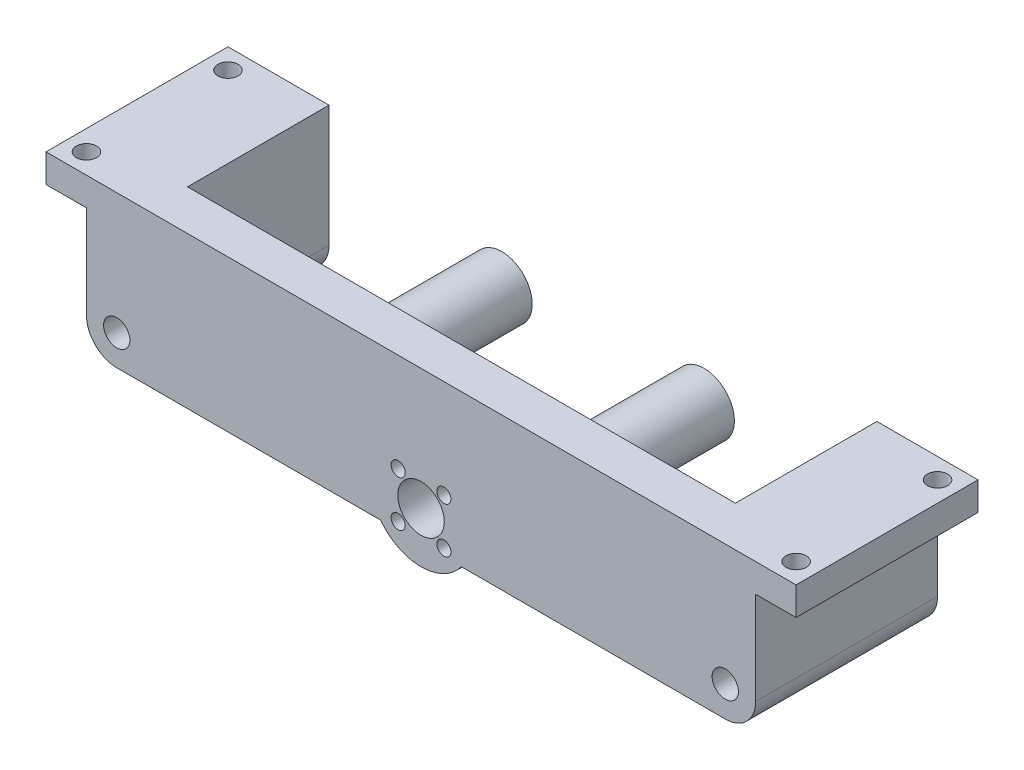
ISO-10303-21;
HEADER;
FILE_DESCRIPTION(('STEP AP214'),'2;1');
FILE_NAME('part.step','',(''),(''),'','','');
FILE_SCHEMA(('AUTOMOTIVE_DESIGN { 1 0 10303 214 1 1 1 1 }'));
ENDSEC;
DATA;
#1=APPLICATION_CONTEXT('core data for automotive mechanical design processes');
#2=APPLICATION_PROTOCOL_DEFINITION('international standard','automotive_design',2000,#1);
#3=PRODUCT_CONTEXT('',#1,'mechanical');
#4=PRODUCT('Part','Part','',(#3));
#5=PRODUCT_RELATED_PRODUCT_CATEGORY('part','',(#4));
#6=PRODUCT_DEFINITION_FORMATION('','',#4);
#7=PRODUCT_DEFINITION_CONTEXT('part definition',#1,'design');
#8=PRODUCT_DEFINITION('design','',#6,#7);
#9=PRODUCT_DEFINITION_SHAPE('','',#8);
#10=(LENGTH_UNIT() NAMED_UNIT(*) SI_UNIT(.MILLI.,.METRE.));
#11=(NAMED_UNIT(*) PLANE_ANGLE_UNIT() SI_UNIT($,.RADIAN.));
#12=(NAMED_UNIT(*) SI_UNIT($,.STERADIAN.) SOLID_ANGLE_UNIT());
#13=UNCERTAINTY_MEASURE_WITH_UNIT(LENGTH_MEASURE(1.E-05),#10,'distance_accuracy_value','');
#14=(GEOMETRIC_REPRESENTATION_CONTEXT(3) GLOBAL_UNCERTAINTY_ASSIGNED_CONTEXT((#13)) GLOBAL_UNIT_ASSIGNED_CONTEXT((#10,
#11,#12)) REPRESENTATION_CONTEXT('',''));
#15=CARTESIAN_POINT('',(0.,0.,0.));
#16=DIRECTION('',(0.,0.,1.));
#17=DIRECTION('',(1.,0.,0.));
#18=AXIS2_PLACEMENT_3D('',#15,#16,#17);
#19=CARTESIAN_POINT('',(0.,0.,0.));
#20=DIRECTION('',(0.,0.,1.));
#21=DIRECTION('',(1.,0.,0.));
#22=AXIS2_PLACEMENT_3D('',#19,#20,#21);
#23=PLANE('',#22);
#24=CARTESIAN_POINT('',(-25.,12.5,0.));
#25=DIRECTION('',(0.,0.,1.));
#26=DIRECTION('',(1.,0.,0.));
#27=AXIS2_PLACEMENT_3D('',#24,#25,#26);
#28=CIRCLE('',#27,7.5);
#29=CARTESIAN_POINT('',(-17.5,12.5,0.));
#30=VERTEX_POINT('',#29);
#31=EDGE_CURVE('E465',#30,#30,#28,.T.);
#32=ORIENTED_EDGE('',*,*,#31,.T.);
#33=EDGE_LOOP('',(#32));
#34=FACE_BOUND('',#33,.T.);
#35=CARTESIAN_POINT('',(25.,12.5,0.));
#36=DIRECTION('',(0.,0.,1.));
#37=DIRECTION('',(1.,0.,0.));
#38=AXIS2_PLACEMENT_3D('',#35,#36,#37);
#39=CIRCLE('',#38,7.5);
#40=CARTESIAN_POINT('',(32.5,12.5,0.));
#41=VERTEX_POINT('',#40);
#42=EDGE_CURVE('E12',#41,#41,#39,.F.);
#43=ORIENTED_EDGE('',*,*,#42,.F.);
#44=EDGE_LOOP('',(#43));
#45=FACE_BOUND('',#44,.T.);
#46=CARTESIAN_POINT('',(-75.25,0.,0.));
#47=DIRECTION('',(0.,0.,-1.));
#48=DIRECTION('',(-1.,0.,0.));
#49=AXIS2_PLACEMENT_3D('',#46,#47,#48);
#50=CIRCLE('',#49,7.50000000000001);
#51=CARTESIAN_POINT('',(-75.25,-7.50000000000002,0.));
#52=VERTEX_POINT('',#51);
#53=CARTESIAN_POINT('',(-67.75,0.,0.));
#54=VERTEX_POINT('',#53);
#55=EDGE_CURVE('E190',#52,#54,#50,.F.);
#56=ORIENTED_EDGE('',*,*,#55,.T.);
#57=DIRECTION('',(0.,1.,0.));
#58=VECTOR('',#57,1.);
#59=CARTESIAN_POINT('',(-67.75,0.,0.));
#60=LINE('',#59,#58);
#61=CARTESIAN_POINT('',(-67.75,30.,0.));
#62=VERTEX_POINT('',#61);
#63=EDGE_CURVE('E195',#54,#62,#60,.T.);
#64=ORIENTED_EDGE('',*,*,#63,.T.);
#65=DIRECTION('',(-1.,0.,0.));
#66=VECTOR('',#65,1.);
#67=CARTESIAN_POINT('',(0.,30.,0.));
#68=LINE('',#67,#66);
#69=CARTESIAN_POINT('',(67.75,30.,0.));
#70=VERTEX_POINT('',#69);
#71=EDGE_CURVE('E307',#70,#62,#68,.T.);
#72=ORIENTED_EDGE('',*,*,#71,.F.);
#73=DIRECTION('',(0.,1.,0.));
#74=VECTOR('',#73,1.);
#75=CARTESIAN_POINT('',(67.75,0.,0.));
#76=LINE('',#75,#74);
#77=CARTESIAN_POINT('',(67.75,0.,0.));
#78=VERTEX_POINT('',#77);
#79=EDGE_CURVE('E323',#78,#70,#76,.T.);
#80=ORIENTED_EDGE('',*,*,#79,.F.);
#81=CARTESIAN_POINT('',(75.25,0.,0.));
#82=DIRECTION('',(0.,0.,-1.));
#83=DIRECTION('',(-1.,0.,0.));
#84=AXIS2_PLACEMENT_3D('',#81,#82,#83);
#85=CIRCLE('',#84,7.50000000000001);
#86=CARTESIAN_POINT('',(75.25,-7.5,0.));
#87=VERTEX_POINT('',#86);
#88=EDGE_CURVE('E182',#87,#78,#85,.T.);
#89=ORIENTED_EDGE('',*,*,#88,.F.);
#90=DIRECTION('',(-1.,0.,0.));
#91=VECTOR('',#90,1.);
#92=CARTESIAN_POINT('',(0.,-7.50000000000001,0.));
#93=LINE('',#92,#91);
#94=CARTESIAN_POINT('',(10.,-7.5,0.));
#95=VERTEX_POINT('',#94);
#96=EDGE_CURVE('E399',#87,#95,#93,.T.);
#97=ORIENTED_EDGE('',*,*,#96,.T.);
#98=CARTESIAN_POINT('',(0.,0.,0.));
#99=DIRECTION('',(0.,0.,1.));
#100=DIRECTION('',(1.,0.,0.));
#101=AXIS2_PLACEMENT_3D('',#98,#99,#100);
#102=CIRCLE('',#101,12.5);
#103=CARTESIAN_POINT('',(-10.,-7.50000000000001,0.));
#104=VERTEX_POINT('',#103);
#105=EDGE_CURVE('E395',#104,#95,#102,.T.);
#106=ORIENTED_EDGE('',*,*,#105,.F.);
#107=DIRECTION('',(1.,0.,0.));
#108=VECTOR('',#107,1.);
#109=CARTESIAN_POINT('',(0.,-7.50000000000001,0.));
#110=LINE('',#109,#108);
#111=EDGE_CURVE('E393',#52,#104,#110,.T.);
#112=ORIENTED_EDGE('',*,*,#111,.F.);
#113=EDGE_LOOP('',(#56,#64,#72,#80,#89,#97,#106,#112));
#114=FACE_BOUND('',#113,.T.);
#115=CARTESIAN_POINT('',(0.,0.,0.));
#116=DIRECTION('',(0.,0.,1.));
#117=DIRECTION('',(1.,0.,0.));
#118=AXIS2_PLACEMENT_3D('',#115,#116,#117);
#119=CIRCLE('',#118,5.75);
#120=CARTESIAN_POINT('',(5.75,0.,0.));
#121=VERTEX_POINT('',#120);
#122=EDGE_CURVE('E354',#121,#121,#119,.T.);
#123=ORIENTED_EDGE('',*,*,#122,.T.);
#124=EDGE_LOOP('',(#123));
#125=FACE_BOUND('',#124,.T.);
#126=CARTESIAN_POINT('',(-5.65685424949238,5.65685424949238,0.));
#127=DIRECTION('',(0.,0.,1.));
#128=DIRECTION('',(1.,0.,0.));
#129=AXIS2_PLACEMENT_3D('',#126,#127,#128);
#130=CIRCLE('',#129,1.75);
#131=CARTESIAN_POINT('',(-3.90685424949238,5.65685424949238,0.));
#132=VERTEX_POINT('',#131);
#133=EDGE_CURVE('E412',#132,#132,#130,.T.);
#134=ORIENTED_EDGE('',*,*,#133,.T.);
#135=EDGE_LOOP('',(#134));
#136=FACE_BOUND('',#135,.T.);
#137=CARTESIAN_POINT('',(5.65685424949238,5.65685424949238,0.));
#138=DIRECTION('',(0.,0.,1.));
#139=DIRECTION('',(1.,0.,0.));
#140=AXIS2_PLACEMENT_3D('',#137,#138,#139);
#141=CIRCLE('',#140,1.75);
#142=CARTESIAN_POINT('',(7.40685424949238,5.65685424949238,0.));
#143=VERTEX_POINT('',#142);
#144=EDGE_CURVE('E409',#143,#143,#141,.T.);
#145=ORIENTED_EDGE('',*,*,#144,.T.);
#146=EDGE_LOOP('',(#145));
#147=FACE_BOUND('',#146,.T.);
#148=CARTESIAN_POINT('',(5.65685424949238,-5.65685424949238,0.));
#149=DIRECTION('',(0.,0.,1.));
#150=DIRECTION('',(1.,0.,0.));
#151=AXIS2_PLACEMENT_3D('',#148,#149,#150);
#152=CIRCLE('',#151,1.75);
#153=CARTESIAN_POINT('',(7.40685424949238,-5.65685424949238,0.));
#154=VERTEX_POINT('',#153);
#155=EDGE_CURVE('E406',#154,#154,#152,.T.);
#156=ORIENTED_EDGE('',*,*,#155,.T.);
#157=EDGE_LOOP('',(#156));
#158=FACE_BOUND('',#157,.T.);
#159=CARTESIAN_POINT('',(-5.65685424949238,-5.65685424949238,0.));
#160=DIRECTION('',(0.,0.,1.));
#161=DIRECTION('',(1.,0.,0.));
#162=AXIS2_PLACEMENT_3D('',#159,#160,#161);
#163=CIRCLE('',#162,1.75);
#164=CARTESIAN_POINT('',(-3.90685424949238,-5.65685424949238,0.));
#165=VERTEX_POINT('',#164);
#166=EDGE_CURVE('E403',#165,#165,#163,.T.);
#167=ORIENTED_EDGE('',*,*,#166,.T.);
#168=EDGE_LOOP('',(#167));
#169=FACE_BOUND('',#168,.T.);
#170=ADVANCED_FACE('F173',(#34,#45,#114,#125,#136,#147,#158,#169),#23,.F.);
#171=CARTESIAN_POINT('',(75.25,0.,10.));
#172=DIRECTION('',(0.,0.,-1.));
#173=DIRECTION('',(-1.,0.,0.));
#174=AXIS2_PLACEMENT_3D('',#171,#172,#173);
#175=CYLINDRICAL_SURFACE('',#174,3.25000000000001);
#176=CARTESIAN_POINT('',(75.25,0.,10.));
#177=DIRECTION('',(0.,0.,1.));
#178=DIRECTION('',(1.,0.,0.));
#179=AXIS2_PLACEMENT_3D('',#176,#177,#178);
#180=CIRCLE('',#179,3.25000000000001);
#181=CARTESIAN_POINT('',(78.5,0.,10.));
#182=VERTEX_POINT('',#181);
#183=EDGE_CURVE('E389',#182,#182,#180,.F.);
#184=ORIENTED_EDGE('',*,*,#183,.F.);
#185=EDGE_LOOP('',(#184));
#186=FACE_BOUND('',#185,.T.);
#187=CARTESIAN_POINT('',(75.25,0.,-35.));
#188=DIRECTION('',(0.,0.,-1.));
#189=DIRECTION('',(-1.,0.,0.));
#190=AXIS2_PLACEMENT_3D('',#187,#188,#189);
#191=CIRCLE('',#190,3.25000000000001);
#192=CARTESIAN_POINT('',(72.,0.,-35.));
#193=VERTEX_POINT('',#192);
#194=EDGE_CURVE('E336',#193,#193,#191,.F.);
#195=ORIENTED_EDGE('',*,*,#194,.F.);
#196=EDGE_LOOP('',(#195));
#197=FACE_BOUND('',#196,.T.);
#198=ADVANCED_FACE('F552',(#186,#197),#175,.F.);
#199=CARTESIAN_POINT('',(75.25,0.,10.));
#200=DIRECTION('',(0.,0.,-1.));
#201=DIRECTION('',(-1.,0.,0.));
#202=AXIS2_PLACEMENT_3D('',#199,#200,#201);
#203=CYLINDRICAL_SURFACE('',#202,7.50000000000001);
#204=DIRECTION('',(0.,0.,-1.));
#205=VECTOR('',#204,1.);
#206=CARTESIAN_POINT('',(75.25,-7.5,10.));
#207=LINE('',#206,#205);
#208=CARTESIAN_POINT('',(75.25,-7.5,10.));
#209=VERTEX_POINT('',#208);
#210=EDGE_CURVE('E420',#209,#87,#207,.T.);
#211=ORIENTED_EDGE('',*,*,#210,.T.);
#212=ORIENTED_EDGE('',*,*,#88,.T.);
#213=DIRECTION('',(0.,0.,1.));
#214=VECTOR('',#213,1.);
#215=CARTESIAN_POINT('',(67.75,0.,-35.));
#216=LINE('',#215,#214);
#217=CARTESIAN_POINT('',(67.75,0.,-35.));
#218=VERTEX_POINT('',#217);
#219=EDGE_CURVE('E346',#218,#78,#216,.T.);
#220=ORIENTED_EDGE('',*,*,#219,.F.);
#221=CARTESIAN_POINT('',(75.25,0.,-35.));
#222=DIRECTION('',(0.,0.,-1.));
#223=DIRECTION('',(-1.,0.,0.));
#224=AXIS2_PLACEMENT_3D('',#221,#222,#223);
#225=CIRCLE('',#224,7.50000000000001);
#226=CARTESIAN_POINT('',(82.75,0.,-35.));
#227=VERTEX_POINT('',#226);
#228=EDGE_CURVE('E322',#227,#218,#225,.T.);
#229=ORIENTED_EDGE('',*,*,#228,.F.);
#230=DIRECTION('',(0.,0.,-1.));
#231=VECTOR('',#230,1.);
#232=CARTESIAN_POINT('',(82.75,0.,10.));
#233=LINE('',#232,#231);
#234=CARTESIAN_POINT('',(82.75,0.,10.));
#235=VERTEX_POINT('',#234);
#236=EDGE_CURVE('E418',#235,#227,#233,.T.);
#237=ORIENTED_EDGE('',*,*,#236,.F.);
#238=CARTESIAN_POINT('',(75.25,0.,10.));
#239=DIRECTION('',(0.,0.,1.));
#240=DIRECTION('',(1.,0.,0.));
#241=AXIS2_PLACEMENT_3D('',#238,#239,#240);
#242=CIRCLE('',#241,7.50000000000001);
#243=EDGE_CURVE('E364',#235,#209,#242,.F.);
#244=ORIENTED_EDGE('',*,*,#243,.T.);
#245=EDGE_LOOP('',(#211,#212,#220,#229,#237,#244));
#246=FACE_BOUND('',#245,.T.);
#247=ADVANCED_FACE('F520',(#246),#203,.T.);
#248=CARTESIAN_POINT('',(0.,0.,10.));
#249=DIRECTION('',(0.,0.,1.));
#250=DIRECTION('',(1.,0.,0.));
#251=AXIS2_PLACEMENT_3D('',#248,#249,#250);
#252=PLANE('',#251);
#253=ORIENTED_EDGE('',*,*,#243,.F.);
#254=DIRECTION('',(0.,-1.,0.));
#255=VECTOR('',#254,1.);
#256=CARTESIAN_POINT('',(82.75,0.,10.));
#257=LINE('',#256,#255);
#258=CARTESIAN_POINT('',(82.75,23.,10.));
#259=VERTEX_POINT('',#258);
#260=EDGE_CURVE('E367',#259,#235,#257,.T.);
#261=ORIENTED_EDGE('',*,*,#260,.F.);
#262=DIRECTION('',(1.,0.,0.));
#263=VECTOR('',#262,1.);
#264=CARTESIAN_POINT('',(82.75,23.,10.));
#265=LINE('',#264,#263);
#266=CARTESIAN_POINT('',(92.75,23.,10.));
#267=VERTEX_POINT('',#266);
#268=EDGE_CURVE('E349',#259,#267,#265,.T.);
#269=ORIENTED_EDGE('',*,*,#268,.T.);
#270=DIRECTION('',(0.,-1.,0.));
#271=VECTOR('',#270,1.);
#272=CARTESIAN_POINT('',(92.75,30.,10.));
#273=LINE('',#272,#271);
#274=CARTESIAN_POINT('',(92.75,30.,10.));
#275=VERTEX_POINT('',#274);
#276=EDGE_CURVE('E443',#275,#267,#273,.T.);
#277=ORIENTED_EDGE('',*,*,#276,.F.);
#278=DIRECTION('',(-1.,0.,0.));
#279=VECTOR('',#278,1.);
#280=CARTESIAN_POINT('',(0.,30.,10.));
#281=LINE('',#280,#279);
#282=CARTESIAN_POINT('',(-92.75,30.,10.));
#283=VERTEX_POINT('',#282);
#284=EDGE_CURVE('E370',#275,#283,#281,.T.);
#285=ORIENTED_EDGE('',*,*,#284,.T.);
#286=DIRECTION('',(0.,-1.,0.));
#287=VECTOR('',#286,1.);
#288=CARTESIAN_POINT('',(-92.75,30.,10.));
#289=LINE('',#288,#287);
#290=CARTESIAN_POINT('',(-92.75,23.,10.));
#291=VERTEX_POINT('',#290);
#292=EDGE_CURVE('E435',#283,#291,#289,.T.);
#293=ORIENTED_EDGE('',*,*,#292,.T.);
#294=DIRECTION('',(-1.,0.,0.));
#295=VECTOR('',#294,1.);
#296=CARTESIAN_POINT('',(-82.75,23.,10.));
#297=LINE('',#296,#295);
#298=CARTESIAN_POINT('',(-82.75,23.,10.));
#299=VERTEX_POINT('',#298);
#300=EDGE_CURVE('E432',#299,#291,#297,.T.);
#301=ORIENTED_EDGE('',*,*,#300,.F.);
#302=DIRECTION('',(0.,-1.,0.));
#303=VECTOR('',#302,1.);
#304=CARTESIAN_POINT('',(-82.75,0.,10.));
#305=LINE('',#304,#303);
#306=CARTESIAN_POINT('',(-82.75,0.,10.));
#307=VERTEX_POINT('',#306);
#308=EDGE_CURVE('E372',#299,#307,#305,.T.);
#309=ORIENTED_EDGE('',*,*,#308,.T.);
#310=CARTESIAN_POINT('',(-75.25,0.,10.));
#311=DIRECTION('',(0.,0.,1.));
#312=DIRECTION('',(1.,0.,0.));
#313=AXIS2_PLACEMENT_3D('',#310,#311,#312);
#314=CIRCLE('',#313,7.50000000000001);
#315=CARTESIAN_POINT('',(-75.25,-7.50000000000002,10.));
#316=VERTEX_POINT('',#315);
#317=EDGE_CURVE('E353',#307,#316,#314,.T.);
#318=ORIENTED_EDGE('',*,*,#317,.T.);
#319=DIRECTION('',(1.,0.,0.));
#320=VECTOR('',#319,1.);
#321=CARTESIAN_POINT('',(0.,-7.50000000000001,10.));
#322=LINE('',#321,#320);
#323=CARTESIAN_POINT('',(-10.,-7.50000000000001,10.));
#324=VERTEX_POINT('',#323);
#325=EDGE_CURVE('E357',#316,#324,#322,.T.);
#326=ORIENTED_EDGE('',*,*,#325,.T.);
#327=CARTESIAN_POINT('',(0.,0.,10.));
#328=DIRECTION('',(0.,0.,1.));
#329=DIRECTION('',(1.,0.,0.));
#330=AXIS2_PLACEMENT_3D('',#327,#328,#329);
#331=CIRCLE('',#330,12.5);
#332=CARTESIAN_POINT('',(10.,-7.5,10.));
#333=VERTEX_POINT('',#332);
#334=EDGE_CURVE('E359',#324,#333,#331,.T.);
#335=ORIENTED_EDGE('',*,*,#334,.T.);
#336=DIRECTION('',(-1.,0.,0.));
#337=VECTOR('',#336,1.);
#338=CARTESIAN_POINT('',(0.,-7.50000000000001,10.));
#339=LINE('',#338,#337);
#340=EDGE_CURVE('E361',#209,#333,#339,.T.);
#341=ORIENTED_EDGE('',*,*,#340,.F.);
#342=EDGE_LOOP('',(#253,#261,#269,#277,#285,#293,#301,#309,#318,#326,#335,#341));
#343=FACE_BOUND('',#342,.T.);
#344=ORIENTED_EDGE('',*,*,#183,.T.);
#345=EDGE_LOOP('',(#344));
#346=FACE_BOUND('',#345,.T.);
#347=CARTESIAN_POINT('',(0.,0.,10.));
#348=DIRECTION('',(0.,0.,1.));
#349=DIRECTION('',(1.,0.,0.));
#350=AXIS2_PLACEMENT_3D('',#347,#348,#349);
#351=CIRCLE('',#350,5.75);
#352=CARTESIAN_POINT('',(5.75,0.,10.));
#353=VERTEX_POINT('',#352);
#354=EDGE_CURVE('E386',#353,#353,#351,.T.);
#355=ORIENTED_EDGE('',*,*,#354,.F.);
#356=EDGE_LOOP('',(#355));
#357=FACE_BOUND('',#356,.T.);
#358=CARTESIAN_POINT('',(-5.65685424949238,5.65685424949238,10.));
#359=DIRECTION('',(0.,0.,1.));
#360=DIRECTION('',(1.,0.,0.));
#361=AXIS2_PLACEMENT_3D('',#358,#359,#360);
#362=CIRCLE('',#361,1.75);
#363=CARTESIAN_POINT('',(-3.90685424949238,5.65685424949238,10.));
#364=VERTEX_POINT('',#363);
#365=EDGE_CURVE('E383',#364,#364,#362,.T.);
#366=ORIENTED_EDGE('',*,*,#365,.F.);
#367=EDGE_LOOP('',(#366));
#368=FACE_BOUND('',#367,.T.);
#369=CARTESIAN_POINT('',(5.65685424949238,5.65685424949238,10.));
#370=DIRECTION('',(0.,0.,1.));
#371=DIRECTION('',(1.,0.,0.));
#372=AXIS2_PLACEMENT_3D('',#369,#370,#371);
#373=CIRCLE('',#372,1.75);
#374=CARTESIAN_POINT('',(7.40685424949238,5.65685424949238,10.));
#375=VERTEX_POINT('',#374);
#376=EDGE_CURVE('E380',#375,#375,#373,.T.);
#377=ORIENTED_EDGE('',*,*,#376,.F.);
#378=EDGE_LOOP('',(#377));
#379=FACE_BOUND('',#378,.T.);
#380=CARTESIAN_POINT('',(5.65685424949238,-5.65685424949238,10.));
#381=DIRECTION('',(0.,0.,1.));
#382=DIRECTION('',(1.,0.,0.));
#383=AXIS2_PLACEMENT_3D('',#380,#381,#382);
#384=CIRCLE('',#383,1.75);
#385=CARTESIAN_POINT('',(7.40685424949238,-5.65685424949238,10.));
#386=VERTEX_POINT('',#385);
#387=EDGE_CURVE('E377',#386,#386,#384,.T.);
#388=ORIENTED_EDGE('',*,*,#387,.F.);
#389=EDGE_LOOP('',(#388));
#390=FACE_BOUND('',#389,.T.);
#391=CARTESIAN_POINT('',(-5.65685424949238,-5.65685424949238,10.));
#392=DIRECTION('',(0.,0.,1.));
#393=DIRECTION('',(1.,0.,0.));
#394=AXIS2_PLACEMENT_3D('',#391,#392,#393);
#395=CIRCLE('',#394,1.75);
#396=CARTESIAN_POINT('',(-3.90685424949238,-5.65685424949238,10.));
#397=VERTEX_POINT('',#396);
#398=EDGE_CURVE('E374',#397,#397,#395,.T.);
#399=ORIENTED_EDGE('',*,*,#398,.F.);
#400=EDGE_LOOP('',(#399));
#401=FACE_BOUND('',#400,.T.);
#402=CARTESIAN_POINT('',(-75.25,0.,10.));
#403=DIRECTION('',(0.,0.,1.));
#404=DIRECTION('',(1.,0.,0.));
#405=AXIS2_PLACEMENT_3D('',#402,#403,#404);
#406=CIRCLE('',#405,3.25000000000001);
#407=CARTESIAN_POINT('',(-72.,0.,10.));
#408=VERTEX_POINT('',#407);
#409=EDGE_CURVE('E350',#408,#408,#406,.T.);
#410=ORIENTED_EDGE('',*,*,#409,.F.);
#411=EDGE_LOOP('',(#410));
#412=FACE_BOUND('',#411,.T.);
#413=ADVANCED_FACE('F502',(#343,#346,#357,#368,#379,#390,#401,#412),#252,.T.);
#414=CARTESIAN_POINT('',(82.75,0.,10.));
#415=DIRECTION('',(1.,0.,0.));
#416=DIRECTION('',(0.,1.,0.));
#417=AXIS2_PLACEMENT_3D('',#414,#415,#416);
#418=PLANE('',#417);
#419=DIRECTION('',(0.,0.,-1.));
#420=VECTOR('',#419,1.);
#421=CARTESIAN_POINT('',(82.75,23.,10.));
#422=LINE('',#421,#420);
#423=CARTESIAN_POINT('',(82.75,23.,-35.));
#424=VERTEX_POINT('',#423);
#425=EDGE_CURVE('E342',#259,#424,#422,.T.);
#426=ORIENTED_EDGE('',*,*,#425,.F.);
#427=ORIENTED_EDGE('',*,*,#260,.T.);
#428=ORIENTED_EDGE('',*,*,#236,.T.);
#429=DIRECTION('',(0.,-1.,0.));
#430=VECTOR('',#429,1.);
#431=CARTESIAN_POINT('',(82.75,0.,-35.));
#432=LINE('',#431,#430);
#433=EDGE_CURVE('E319',#424,#227,#432,.T.);
#434=ORIENTED_EDGE('',*,*,#433,.F.);
#435=EDGE_LOOP('',(#426,#427,#428,#434));
#436=FACE_BOUND('',#435,.T.);
#437=ADVANCED_FACE('F548',(#436),#418,.T.);
#438=CARTESIAN_POINT('',(0.,30.,10.));
#439=DIRECTION('',(0.,-1.,0.));
#440=DIRECTION('',(1.,0.,0.));
#441=AXIS2_PLACEMENT_3D('',#438,#439,#440);
#442=PLANE('',#441);
#443=CARTESIAN_POINT('',(-87.75,30.,5.));
#444=DIRECTION('',(0.,1.,0.));
#445=DIRECTION('',(-1.,0.,0.));
#446=AXIS2_PLACEMENT_3D('',#443,#444,#445);
#447=CIRCLE('',#446,2.49999999999999);
#448=CARTESIAN_POINT('',(-90.25,30.,5.));
#449=VERTEX_POINT('',#448);
#450=EDGE_CURVE('E962',#449,#449,#447,.T.);
#451=ORIENTED_EDGE('',*,*,#450,.F.);
#452=EDGE_LOOP('',(#451));
#453=FACE_BOUND('',#452,.T.);
#454=CARTESIAN_POINT('',(87.75,30.,-30.));
#455=DIRECTION('',(0.,1.,0.));
#456=DIRECTION('',(-1.,0.,0.));
#457=AXIS2_PLACEMENT_3D('',#454,#455,#456);
#458=CIRCLE('',#457,2.50000000000001);
#459=CARTESIAN_POINT('',(85.25,30.,-30.));
#460=VERTEX_POINT('',#459);
#461=EDGE_CURVE('E960',#460,#460,#458,.T.);
#462=ORIENTED_EDGE('',*,*,#461,.F.);
#463=EDGE_LOOP('',(#462));
#464=FACE_BOUND('',#463,.T.);
#465=CARTESIAN_POINT('',(87.75,30.,4.99999999999997));
#466=DIRECTION('',(0.,1.,0.));
#467=DIRECTION('',(-1.,0.,0.));
#468=AXIS2_PLACEMENT_3D('',#465,#466,#467);
#469=CIRCLE('',#468,2.49999999999999);
#470=CARTESIAN_POINT('',(85.25,30.,4.99999999999997));
#471=VERTEX_POINT('',#470);
#472=EDGE_CURVE('E963',#471,#471,#469,.T.);
#473=ORIENTED_EDGE('',*,*,#472,.F.);
#474=EDGE_LOOP('',(#473));
#475=FACE_BOUND('',#474,.T.);
#476=CARTESIAN_POINT('',(-87.75,30.,-30.));
#477=DIRECTION('',(0.,1.,0.));
#478=DIRECTION('',(-1.,0.,0.));
#479=AXIS2_PLACEMENT_3D('',#476,#477,#478);
#480=CIRCLE('',#479,2.50000000000001);
#481=CARTESIAN_POINT('',(-90.25,30.,-30.));
#482=VERTEX_POINT('',#481);
#483=EDGE_CURVE('E454',#482,#482,#480,.T.);
#484=ORIENTED_EDGE('',*,*,#483,.F.);
#485=EDGE_LOOP('',(#484));
#486=FACE_BOUND('',#485,.T.);
#487=DIRECTION('',(0.,0.,-1.));
#488=VECTOR('',#487,1.);
#489=CARTESIAN_POINT('',(92.75,30.,10.));
#490=LINE('',#489,#488);
#491=CARTESIAN_POINT('',(92.75,30.,-35.));
#492=VERTEX_POINT('',#491);
#493=EDGE_CURVE('E446',#275,#492,#490,.T.);
#494=ORIENTED_EDGE('',*,*,#493,.T.);
#495=DIRECTION('',(1.,0.,0.));
#496=VECTOR('',#495,1.);
#497=CARTESIAN_POINT('',(0.,30.,-35.));
#498=LINE('',#497,#496);
#499=CARTESIAN_POINT('',(67.75,30.,-35.));
#500=VERTEX_POINT('',#499);
#501=EDGE_CURVE('E327',#500,#492,#498,.T.);
#502=ORIENTED_EDGE('',*,*,#501,.F.);
#503=DIRECTION('',(0.,0.,1.));
#504=VECTOR('',#503,1.);
#505=CARTESIAN_POINT('',(67.75,30.,-35.));
#506=LINE('',#505,#504);
#507=EDGE_CURVE('E339',#500,#70,#506,.T.);
#508=ORIENTED_EDGE('',*,*,#507,.T.);
#509=ORIENTED_EDGE('',*,*,#71,.T.);
#510=DIRECTION('',(0.,0.,1.));
#511=VECTOR('',#510,1.);
#512=CARTESIAN_POINT('',(-67.75,30.,-35.));
#513=LINE('',#512,#511);
#514=CARTESIAN_POINT('',(-67.75,30.,-35.));
#515=VERTEX_POINT('',#514);
#516=EDGE_CURVE('E304',#515,#62,#513,.T.);
#517=ORIENTED_EDGE('',*,*,#516,.F.);
#518=DIRECTION('',(1.,0.,0.));
#519=VECTOR('',#518,1.);
#520=CARTESIAN_POINT('',(0.,30.,-35.));
#521=LINE('',#520,#519);
#522=CARTESIAN_POINT('',(-92.75,30.,-35.));
#523=VERTEX_POINT('',#522);
#524=EDGE_CURVE('E288',#523,#515,#521,.T.);
#525=ORIENTED_EDGE('',*,*,#524,.F.);
#526=DIRECTION('',(0.,0.,-1.));
#527=VECTOR('',#526,1.);
#528=CARTESIAN_POINT('',(-92.75,30.,10.));
#529=LINE('',#528,#527);
#530=EDGE_CURVE('E396',#283,#523,#529,.T.);
#531=ORIENTED_EDGE('',*,*,#530,.F.);
#532=ORIENTED_EDGE('',*,*,#284,.F.);
#533=EDGE_LOOP('',(#494,#502,#508,#509,#517,#525,#531,#532));
#534=FACE_BOUND('',#533,.T.);
#535=ADVANCED_FACE('F305',(#453,#464,#475,#486,#534),#442,.F.);
#536=CARTESIAN_POINT('',(-82.75,0.,10.));
#537=DIRECTION('',(1.,0.,0.));
#538=DIRECTION('',(0.,1.,0.));
#539=AXIS2_PLACEMENT_3D('',#536,#537,#538);
#540=PLANE('',#539);
#541=ORIENTED_EDGE('',*,*,#308,.F.);
#542=DIRECTION('',(0.,0.,-1.));
#543=VECTOR('',#542,1.);
#544=CARTESIAN_POINT('',(-82.75,23.,10.));
#545=LINE('',#544,#543);
#546=CARTESIAN_POINT('',(-82.75,23.,-35.));
#547=VERTEX_POINT('',#546);
#548=EDGE_CURVE('E431',#299,#547,#545,.T.);
#549=ORIENTED_EDGE('',*,*,#548,.T.);
#550=DIRECTION('',(0.,1.,0.));
#551=VECTOR('',#550,1.);
#552=CARTESIAN_POINT('',(-82.75,0.,-35.));
#553=LINE('',#552,#551);
#554=CARTESIAN_POINT('',(-82.75,0.,-35.));
#555=VERTEX_POINT('',#554);
#556=EDGE_CURVE('E315',#555,#547,#553,.T.);
#557=ORIENTED_EDGE('',*,*,#556,.F.);
#558=DIRECTION('',(0.,0.,-1.));
#559=VECTOR('',#558,1.);
#560=CARTESIAN_POINT('',(-82.75,0.,10.));
#561=LINE('',#560,#559);
#562=EDGE_CURVE('E392',#307,#555,#561,.T.);
#563=ORIENTED_EDGE('',*,*,#562,.F.);
#564=EDGE_LOOP('',(#541,#549,#557,#563));
#565=FACE_BOUND('',#564,.T.);
#566=ADVANCED_FACE('F539',(#565),#540,.F.);
#567=CARTESIAN_POINT('',(-75.25,0.,10.));
#568=DIRECTION('',(0.,0.,-1.));
#569=DIRECTION('',(-1.,0.,0.));
#570=AXIS2_PLACEMENT_3D('',#567,#568,#569);
#571=CYLINDRICAL_SURFACE('',#570,7.50000000000001);
#572=ORIENTED_EDGE('',*,*,#562,.T.);
#573=CARTESIAN_POINT('',(-75.25,0.,-35.));
#574=DIRECTION('',(0.,0.,-1.));
#575=DIRECTION('',(-1.,0.,0.));
#576=AXIS2_PLACEMENT_3D('',#573,#574,#575);
#577=CIRCLE('',#576,7.50000000000001);
#578=CARTESIAN_POINT('',(-67.75,0.,-35.));
#579=VERTEX_POINT('',#578);
#580=EDGE_CURVE('E312',#555,#579,#577,.F.);
#581=ORIENTED_EDGE('',*,*,#580,.T.);
#582=DIRECTION('',(0.,0.,1.));
#583=VECTOR('',#582,1.);
#584=CARTESIAN_POINT('',(-67.75,0.,-35.));
#585=LINE('',#584,#583);
#586=EDGE_CURVE('E309',#579,#54,#585,.T.);
#587=ORIENTED_EDGE('',*,*,#586,.T.);
#588=ORIENTED_EDGE('',*,*,#55,.F.);
#589=DIRECTION('',(0.,0.,-1.));
#590=VECTOR('',#589,1.);
#591=CARTESIAN_POINT('',(-75.25,-7.50000000000002,10.));
#592=LINE('',#591,#590);
#593=EDGE_CURVE('E428',#316,#52,#592,.T.);
#594=ORIENTED_EDGE('',*,*,#593,.F.);
#595=ORIENTED_EDGE('',*,*,#317,.F.);
#596=EDGE_LOOP('',(#572,#581,#587,#588,#594,#595));
#597=FACE_BOUND('',#596,.T.);
#598=ADVANCED_FACE('F537',(#597),#571,.T.);
#599=CARTESIAN_POINT('',(0.,-7.50000000000001,10.));
#600=DIRECTION('',(0.,1.,0.));
#601=DIRECTION('',(-1.,0.,0.));
#602=AXIS2_PLACEMENT_3D('',#599,#600,#601);
#603=PLANE('',#602);
#604=ORIENTED_EDGE('',*,*,#111,.T.);
#605=DIRECTION('',(0.,0.,-1.));
#606=VECTOR('',#605,1.);
#607=CARTESIAN_POINT('',(-10.,-7.50000000000001,10.));
#608=LINE('',#607,#606);
#609=EDGE_CURVE('E425',#324,#104,#608,.T.);
#610=ORIENTED_EDGE('',*,*,#609,.F.);
#611=ORIENTED_EDGE('',*,*,#325,.F.);
#612=ORIENTED_EDGE('',*,*,#593,.T.);
#613=EDGE_LOOP('',(#604,#610,#611,#612));
#614=FACE_BOUND('',#613,.T.);
#615=ADVANCED_FACE('F533',(#614),#603,.F.);
#616=CARTESIAN_POINT('',(0.,0.,10.));
#617=DIRECTION('',(0.,0.,-1.));
#618=DIRECTION('',(-1.,0.,0.));
#619=AXIS2_PLACEMENT_3D('',#616,#617,#618);
#620=CYLINDRICAL_SURFACE('',#619,12.5);
#621=ORIENTED_EDGE('',*,*,#105,.T.);
#622=DIRECTION('',(0.,0.,-1.));
#623=VECTOR('',#622,1.);
#624=CARTESIAN_POINT('',(10.,-7.5,10.));
#625=LINE('',#624,#623);
#626=EDGE_CURVE('E423',#333,#95,#625,.T.);
#627=ORIENTED_EDGE('',*,*,#626,.F.);
#628=ORIENTED_EDGE('',*,*,#334,.F.);
#629=ORIENTED_EDGE('',*,*,#609,.T.);
#630=EDGE_LOOP('',(#621,#627,#628,#629));
#631=FACE_BOUND('',#630,.T.);
#632=ADVANCED_FACE('F529',(#631),#620,.T.);
#633=CARTESIAN_POINT('',(0.,-7.50000000000001,10.));
#634=DIRECTION('',(0.,-1.,0.));
#635=DIRECTION('',(1.,0.,0.));
#636=AXIS2_PLACEMENT_3D('',#633,#634,#635);
#637=PLANE('',#636);
#638=ORIENTED_EDGE('',*,*,#96,.F.);
#639=ORIENTED_EDGE('',*,*,#210,.F.);
#640=ORIENTED_EDGE('',*,*,#340,.T.);
#641=ORIENTED_EDGE('',*,*,#626,.T.);
#642=EDGE_LOOP('',(#638,#639,#640,#641));
#643=FACE_BOUND('',#642,.T.);
#644=ADVANCED_FACE('F525',(#643),#637,.T.);
#645=CARTESIAN_POINT('',(-75.25,0.,10.));
#646=DIRECTION('',(0.,0.,-1.));
#647=DIRECTION('',(-1.,0.,0.));
#648=AXIS2_PLACEMENT_3D('',#645,#646,#647);
#649=CYLINDRICAL_SURFACE('',#648,3.25000000000001);
#650=ORIENTED_EDGE('',*,*,#409,.T.);
#651=EDGE_LOOP('',(#650));
#652=FACE_BOUND('',#651,.T.);
#653=CARTESIAN_POINT('',(-75.25,0.,-35.));
#654=DIRECTION('',(0.,0.,-1.));
#655=DIRECTION('',(-1.,0.,0.));
#656=AXIS2_PLACEMENT_3D('',#653,#654,#655);
#657=CIRCLE('',#656,3.25000000000001);
#658=CARTESIAN_POINT('',(-78.5,0.,-35.));
#659=VERTEX_POINT('',#658);
#660=EDGE_CURVE('E301',#659,#659,#657,.F.);
#661=ORIENTED_EDGE('',*,*,#660,.F.);
#662=EDGE_LOOP('',(#661));
#663=FACE_BOUND('',#662,.T.);
#664=ADVANCED_FACE('F584',(#652,#663),#649,.F.);
#665=CARTESIAN_POINT('',(-5.65685424949238,-5.65685424949238,10.));
#666=DIRECTION('',(0.,0.,-1.));
#667=DIRECTION('',(-1.,0.,0.));
#668=AXIS2_PLACEMENT_3D('',#665,#666,#667);
#669=CYLINDRICAL_SURFACE('',#668,1.75);
#670=ORIENTED_EDGE('',*,*,#398,.T.);
#671=EDGE_LOOP('',(#670));
#672=FACE_BOUND('',#671,.T.);
#673=ORIENTED_EDGE('',*,*,#166,.F.);
#674=EDGE_LOOP('',(#673));
#675=FACE_BOUND('',#674,.T.);
#676=ADVANCED_FACE('F581',(#672,#675),#669,.F.);
#677=CARTESIAN_POINT('',(5.65685424949238,-5.65685424949238,10.));
#678=DIRECTION('',(0.,0.,-1.));
#679=DIRECTION('',(-1.,0.,0.));
#680=AXIS2_PLACEMENT_3D('',#677,#678,#679);
#681=CYLINDRICAL_SURFACE('',#680,1.75);
#682=ORIENTED_EDGE('',*,*,#387,.T.);
#683=EDGE_LOOP('',(#682));
#684=FACE_BOUND('',#683,.T.);
#685=ORIENTED_EDGE('',*,*,#155,.F.);
#686=EDGE_LOOP('',(#685));
#687=FACE_BOUND('',#686,.T.);
#688=ADVANCED_FACE('F578',(#684,#687),#681,.F.);
#689=CARTESIAN_POINT('',(5.65685424949238,5.65685424949238,10.));
#690=DIRECTION('',(0.,0.,-1.));
#691=DIRECTION('',(-1.,0.,0.));
#692=AXIS2_PLACEMENT_3D('',#689,#690,#691);
#693=CYLINDRICAL_SURFACE('',#692,1.75);
#694=ORIENTED_EDGE('',*,*,#376,.T.);
#695=EDGE_LOOP('',(#694));
#696=FACE_BOUND('',#695,.T.);
#697=ORIENTED_EDGE('',*,*,#144,.F.);
#698=EDGE_LOOP('',(#697));
#699=FACE_BOUND('',#698,.T.);
#700=ADVANCED_FACE('F574',(#696,#699),#693,.F.);
#701=CARTESIAN_POINT('',(-5.65685424949238,5.65685424949238,10.));
#702=DIRECTION('',(0.,0.,-1.));
#703=DIRECTION('',(-1.,0.,0.));
#704=AXIS2_PLACEMENT_3D('',#701,#702,#703);
#705=CYLINDRICAL_SURFACE('',#704,1.75);
#706=ORIENTED_EDGE('',*,*,#365,.T.);
#707=EDGE_LOOP('',(#706));
#708=FACE_BOUND('',#707,.T.);
#709=ORIENTED_EDGE('',*,*,#133,.F.);
#710=EDGE_LOOP('',(#709));
#711=FACE_BOUND('',#710,.T.);
#712=ADVANCED_FACE('F570',(#708,#711),#705,.F.);
#713=CARTESIAN_POINT('',(0.,0.,10.));
#714=DIRECTION('',(0.,0.,-1.));
#715=DIRECTION('',(-1.,0.,0.));
#716=AXIS2_PLACEMENT_3D('',#713,#714,#715);
#717=CYLINDRICAL_SURFACE('',#716,5.75);
#718=ORIENTED_EDGE('',*,*,#354,.T.);
#719=EDGE_LOOP('',(#718));
#720=FACE_BOUND('',#719,.T.);
#721=ORIENTED_EDGE('',*,*,#122,.F.);
#722=EDGE_LOOP('',(#721));
#723=FACE_BOUND('',#722,.T.);
#724=ADVANCED_FACE('F567',(#720,#723),#717,.F.);
#725=CARTESIAN_POINT('',(92.75,30.,10.));
#726=DIRECTION('',(1.,0.,0.));
#727=DIRECTION('',(0.,0.,-1.));
#728=AXIS2_PLACEMENT_3D('',#725,#726,#727);
#729=PLANE('',#728);
#730=DIRECTION('',(0.,0.,-1.));
#731=VECTOR('',#730,1.);
#732=CARTESIAN_POINT('',(92.75,23.,10.));
#733=LINE('',#732,#731);
#734=CARTESIAN_POINT('',(92.75,23.,-35.));
#735=VERTEX_POINT('',#734);
#736=EDGE_CURVE('E436',#267,#735,#733,.T.);
#737=ORIENTED_EDGE('',*,*,#736,.T.);
#738=DIRECTION('',(0.,-1.,0.));
#739=VECTOR('',#738,1.);
#740=CARTESIAN_POINT('',(92.75,0.,-35.));
#741=LINE('',#740,#739);
#742=EDGE_CURVE('E330',#492,#735,#741,.T.);
#743=ORIENTED_EDGE('',*,*,#742,.F.);
#744=ORIENTED_EDGE('',*,*,#493,.F.);
#745=ORIENTED_EDGE('',*,*,#276,.T.);
#746=EDGE_LOOP('',(#737,#743,#744,#745));
#747=FACE_BOUND('',#746,.T.);
#748=ADVANCED_FACE('F500',(#747),#729,.T.);
#749=CARTESIAN_POINT('',(82.75,23.,10.));
#750=DIRECTION('',(0.,1.,0.));
#751=DIRECTION('',(0.,0.,1.));
#752=AXIS2_PLACEMENT_3D('',#749,#750,#751);
#753=PLANE('',#752);
#754=CARTESIAN_POINT('',(87.75,23.,-30.));
#755=DIRECTION('',(0.,1.,0.));
#756=DIRECTION('',(0.,0.,1.));
#757=AXIS2_PLACEMENT_3D('',#754,#755,#756);
#758=CIRCLE('',#757,2.50000000000001);
#759=CARTESIAN_POINT('',(87.75,23.,-27.5));
#760=VERTEX_POINT('',#759);
#761=EDGE_CURVE('E177',#760,#760,#758,.T.);
#762=ORIENTED_EDGE('',*,*,#761,.T.);
#763=EDGE_LOOP('',(#762));
#764=FACE_BOUND('',#763,.T.);
#765=CARTESIAN_POINT('',(87.75,23.,4.99999999999997));
#766=DIRECTION('',(0.,1.,0.));
#767=DIRECTION('',(0.,0.,1.));
#768=AXIS2_PLACEMENT_3D('',#765,#766,#767);
#769=CIRCLE('',#768,2.49999999999999);
#770=CARTESIAN_POINT('',(87.75,23.,7.49999999999996));
#771=VERTEX_POINT('',#770);
#772=EDGE_CURVE('E456',#771,#771,#769,.T.);
#773=ORIENTED_EDGE('',*,*,#772,.T.);
#774=EDGE_LOOP('',(#773));
#775=FACE_BOUND('',#774,.T.);
#776=ORIENTED_EDGE('',*,*,#425,.T.);
#777=DIRECTION('',(-1.,0.,0.));
#778=VECTOR('',#777,1.);
#779=CARTESIAN_POINT('',(0.,23.,-35.));
#780=LINE('',#779,#778);
#781=EDGE_CURVE('E333',#735,#424,#780,.T.);
#782=ORIENTED_EDGE('',*,*,#781,.F.);
#783=ORIENTED_EDGE('',*,*,#736,.F.);
#784=ORIENTED_EDGE('',*,*,#268,.F.);
#785=EDGE_LOOP('',(#776,#782,#783,#784));
#786=FACE_BOUND('',#785,.T.);
#787=ADVANCED_FACE('F175',(#764,#775,#786),#753,.F.);
#788=CARTESIAN_POINT('',(-92.75,30.,10.));
#789=DIRECTION('',(1.,0.,0.));
#790=DIRECTION('',(0.,0.,-1.));
#791=AXIS2_PLACEMENT_3D('',#788,#789,#790);
#792=PLANE('',#791);
#793=ORIENTED_EDGE('',*,*,#530,.T.);
#794=DIRECTION('',(0.,1.,0.));
#795=VECTOR('',#794,1.);
#796=CARTESIAN_POINT('',(-92.75,0.,-35.));
#797=LINE('',#796,#795);
#798=CARTESIAN_POINT('',(-92.75,23.,-35.));
#799=VERTEX_POINT('',#798);
#800=EDGE_CURVE('E298',#799,#523,#797,.T.);
#801=ORIENTED_EDGE('',*,*,#800,.F.);
#802=DIRECTION('',(0.,0.,-1.));
#803=VECTOR('',#802,1.);
#804=CARTESIAN_POINT('',(-92.75,23.,10.));
#805=LINE('',#804,#803);
#806=EDGE_CURVE('E438',#291,#799,#805,.T.);
#807=ORIENTED_EDGE('',*,*,#806,.F.);
#808=ORIENTED_EDGE('',*,*,#292,.F.);
#809=EDGE_LOOP('',(#793,#801,#807,#808));
#810=FACE_BOUND('',#809,.T.);
#811=ADVANCED_FACE('F493',(#810),#792,.F.);
#812=CARTESIAN_POINT('',(-82.75,23.,10.));
#813=DIRECTION('',(0.,-1.,0.));
#814=DIRECTION('',(0.,0.,-1.));
#815=AXIS2_PLACEMENT_3D('',#812,#813,#814);
#816=PLANE('',#815);
#817=CARTESIAN_POINT('',(-87.75,23.,5.));
#818=DIRECTION('',(0.,-1.,0.));
#819=DIRECTION('',(0.,0.,-1.));
#820=AXIS2_PLACEMENT_3D('',#817,#818,#819);
#821=CIRCLE('',#820,2.49999999999999);
#822=CARTESIAN_POINT('',(-87.75,23.,2.5));
#823=VERTEX_POINT('',#822);
#824=EDGE_CURVE('E453',#823,#823,#821,.T.);
#825=ORIENTED_EDGE('',*,*,#824,.F.);
#826=EDGE_LOOP('',(#825));
#827=FACE_BOUND('',#826,.T.);
#828=CARTESIAN_POINT('',(-87.75,23.,-30.));
#829=DIRECTION('',(0.,-1.,0.));
#830=DIRECTION('',(0.,0.,-1.));
#831=AXIS2_PLACEMENT_3D('',#828,#829,#830);
#832=CIRCLE('',#831,2.50000000000001);
#833=CARTESIAN_POINT('',(-87.75,23.,-32.5));
#834=VERTEX_POINT('',#833);
#835=EDGE_CURVE('E450',#834,#834,#832,.T.);
#836=ORIENTED_EDGE('',*,*,#835,.F.);
#837=EDGE_LOOP('',(#836));
#838=FACE_BOUND('',#837,.T.);
#839=ORIENTED_EDGE('',*,*,#806,.T.);
#840=DIRECTION('',(-1.,0.,0.));
#841=VECTOR('',#840,1.);
#842=CARTESIAN_POINT('',(0.,23.,-35.));
#843=LINE('',#842,#841);
#844=EDGE_CURVE('E481',#547,#799,#843,.T.);
#845=ORIENTED_EDGE('',*,*,#844,.F.);
#846=ORIENTED_EDGE('',*,*,#548,.F.);
#847=ORIENTED_EDGE('',*,*,#300,.T.);
#848=EDGE_LOOP('',(#839,#845,#846,#847));
#849=FACE_BOUND('',#848,.T.);
#850=ADVANCED_FACE('F488',(#827,#838,#849),#816,.T.);
#851=CARTESIAN_POINT('',(67.75,0.,-35.));
#852=DIRECTION('',(1.,0.,0.));
#853=DIRECTION('',(0.,0.,-1.));
#854=AXIS2_PLACEMENT_3D('',#851,#852,#853);
#855=PLANE('',#854);
#856=ORIENTED_EDGE('',*,*,#79,.T.);
#857=ORIENTED_EDGE('',*,*,#507,.F.);
#858=DIRECTION('',(0.,1.,0.));
#859=VECTOR('',#858,1.);
#860=CARTESIAN_POINT('',(67.75,0.,-35.));
#861=LINE('',#860,#859);
#862=EDGE_CURVE('E325',#218,#500,#861,.T.);
#863=ORIENTED_EDGE('',*,*,#862,.F.);
#864=ORIENTED_EDGE('',*,*,#219,.T.);
#865=EDGE_LOOP('',(#856,#857,#863,#864));
#866=FACE_BOUND('',#865,.T.);
#867=ADVANCED_FACE('F516',(#866),#855,.F.);
#868=CARTESIAN_POINT('',(0.,0.,-35.));
#869=DIRECTION('',(0.,0.,-1.));
#870=DIRECTION('',(-1.,0.,0.));
#871=AXIS2_PLACEMENT_3D('',#868,#869,#870);
#872=PLANE('',#871);
#873=ORIENTED_EDGE('',*,*,#433,.T.);
#874=ORIENTED_EDGE('',*,*,#228,.T.);
#875=ORIENTED_EDGE('',*,*,#862,.T.);
#876=ORIENTED_EDGE('',*,*,#501,.T.);
#877=ORIENTED_EDGE('',*,*,#742,.T.);
#878=ORIENTED_EDGE('',*,*,#781,.T.);
#879=EDGE_LOOP('',(#873,#874,#875,#876,#877,#878));
#880=FACE_BOUND('',#879,.T.);
#881=ORIENTED_EDGE('',*,*,#194,.T.);
#882=EDGE_LOOP('',(#881));
#883=FACE_BOUND('',#882,.T.);
#884=ADVANCED_FACE('F510',(#880,#883),#872,.T.);
#885=CARTESIAN_POINT('',(-67.75,0.,-35.));
#886=DIRECTION('',(1.,0.,0.));
#887=DIRECTION('',(0.,0.,-1.));
#888=AXIS2_PLACEMENT_3D('',#885,#886,#887);
#889=PLANE('',#888);
#890=ORIENTED_EDGE('',*,*,#63,.F.);
#891=ORIENTED_EDGE('',*,*,#586,.F.);
#892=DIRECTION('',(0.,1.,0.));
#893=VECTOR('',#892,1.);
#894=CARTESIAN_POINT('',(-67.75,0.,-35.));
#895=LINE('',#894,#893);
#896=EDGE_CURVE('E294',#579,#515,#895,.T.);
#897=ORIENTED_EDGE('',*,*,#896,.T.);
#898=ORIENTED_EDGE('',*,*,#516,.T.);
#899=EDGE_LOOP('',(#890,#891,#897,#898));
#900=FACE_BOUND('',#899,.T.);
#901=ADVANCED_FACE('F311',(#900),#889,.T.);
#902=CARTESIAN_POINT('',(0.,0.,-35.));
#903=DIRECTION('',(0.,0.,-1.));
#904=DIRECTION('',(-1.,0.,0.));
#905=AXIS2_PLACEMENT_3D('',#902,#903,#904);
#906=PLANE('',#905);
#907=ORIENTED_EDGE('',*,*,#896,.F.);
#908=ORIENTED_EDGE('',*,*,#580,.F.);
#909=ORIENTED_EDGE('',*,*,#556,.T.);
#910=ORIENTED_EDGE('',*,*,#844,.T.);
#911=ORIENTED_EDGE('',*,*,#800,.T.);
#912=ORIENTED_EDGE('',*,*,#524,.T.);
#913=EDGE_LOOP('',(#907,#908,#909,#910,#911,#912));
#914=FACE_BOUND('',#913,.T.);
#915=ORIENTED_EDGE('',*,*,#660,.T.);
#916=EDGE_LOOP('',(#915));
#917=FACE_BOUND('',#916,.T.);
#918=ADVANCED_FACE('F290',(#914,#917),#906,.T.);
#919=CARTESIAN_POINT('',(25.,12.5,-35.));
#920=DIRECTION('',(0.,0.,1.));
#921=DIRECTION('',(1.,0.,0.));
#922=AXIS2_PLACEMENT_3D('',#919,#920,#921);
#923=CYLINDRICAL_SURFACE('',#922,7.5);
#924=CARTESIAN_POINT('',(25.,12.5,-35.));
#925=DIRECTION('',(0.,0.,-1.));
#926=DIRECTION('',(-1.,0.,0.));
#927=AXIS2_PLACEMENT_3D('',#924,#925,#926);
#928=CIRCLE('',#927,7.5);
#929=CARTESIAN_POINT('',(17.5,12.5,-35.));
#930=VERTEX_POINT('',#929);
#931=EDGE_CURVE('E470',#930,#930,#928,.T.);
#932=ORIENTED_EDGE('',*,*,#931,.F.);
#933=EDGE_LOOP('',(#932));
#934=FACE_BOUND('',#933,.T.);
#935=ORIENTED_EDGE('',*,*,#42,.T.);
#936=EDGE_LOOP('',(#935));
#937=FACE_BOUND('',#936,.T.);
#938=ADVANCED_FACE('F603',(#934,#937),#923,.T.);
#939=CARTESIAN_POINT('',(25.,12.5,-35.));
#940=DIRECTION('',(0.,0.,-1.));
#941=DIRECTION('',(-1.,0.,0.));
#942=AXIS2_PLACEMENT_3D('',#939,#940,#941);
#943=PLANE('',#942);
#944=ORIENTED_EDGE('',*,*,#931,.T.);
#945=EDGE_LOOP('',(#944));
#946=FACE_BOUND('',#945,.T.);
#947=ADVANCED_FACE('F609',(#946),#943,.T.);
#948=CARTESIAN_POINT('',(-25.,12.5,-35.));
#949=DIRECTION('',(0.,0.,1.));
#950=DIRECTION('',(1.,0.,0.));
#951=AXIS2_PLACEMENT_3D('',#948,#949,#950);
#952=CYLINDRICAL_SURFACE('',#951,7.5);
#953=CARTESIAN_POINT('',(-25.,12.5,-35.));
#954=DIRECTION('',(0.,0.,1.));
#955=DIRECTION('',(1.,0.,0.));
#956=AXIS2_PLACEMENT_3D('',#953,#954,#955);
#957=CIRCLE('',#956,7.5);
#958=CARTESIAN_POINT('',(-17.5,12.5,-35.));
#959=VERTEX_POINT('',#958);
#960=EDGE_CURVE('E461',#959,#959,#957,.T.);
#961=ORIENTED_EDGE('',*,*,#960,.T.);
#962=EDGE_LOOP('',(#961));
#963=FACE_BOUND('',#962,.T.);
#964=ORIENTED_EDGE('',*,*,#31,.F.);
#965=EDGE_LOOP('',(#964));
#966=FACE_BOUND('',#965,.T.);
#967=ADVANCED_FACE('F651',(#963,#966),#952,.T.);
#968=CARTESIAN_POINT('',(-25.,12.5,-35.));
#969=DIRECTION('',(0.,0.,1.));
#970=DIRECTION('',(1.,0.,0.));
#971=AXIS2_PLACEMENT_3D('',#968,#969,#970);
#972=PLANE('',#971);
#973=ORIENTED_EDGE('',*,*,#960,.F.);
#974=EDGE_LOOP('',(#973));
#975=FACE_BOUND('',#974,.T.);
#976=ADVANCED_FACE('F646',(#975),#972,.F.);
#977=CARTESIAN_POINT('',(-87.75,-5.00000000000002,-30.));
#978=DIRECTION('',(0.,1.,0.));
#979=DIRECTION('',(-1.,0.,0.));
#980=AXIS2_PLACEMENT_3D('',#977,#978,#979);
#981=CYLINDRICAL_SURFACE('',#980,2.50000000000001);
#982=ORIENTED_EDGE('',*,*,#835,.T.);
#983=EDGE_LOOP('',(#982));
#984=FACE_BOUND('',#983,.T.);
#985=ORIENTED_EDGE('',*,*,#483,.T.);
#986=EDGE_LOOP('',(#985));
#987=FACE_BOUND('',#986,.T.);
#988=ADVANCED_FACE('F650',(#984,#987),#981,.F.);
#989=CARTESIAN_POINT('',(-87.75,-5.00000000000002,5.));
#990=DIRECTION('',(0.,1.,0.));
#991=DIRECTION('',(-1.,0.,0.));
#992=AXIS2_PLACEMENT_3D('',#989,#990,#991);
#993=CYLINDRICAL_SURFACE('',#992,2.49999999999999);
#994=ORIENTED_EDGE('',*,*,#824,.T.);
#995=EDGE_LOOP('',(#994));
#996=FACE_BOUND('',#995,.T.);
#997=ORIENTED_EDGE('',*,*,#450,.T.);
#998=EDGE_LOOP('',(#997));
#999=FACE_BOUND('',#998,.T.);
#1000=ADVANCED_FACE('F923',(#996,#999),#993,.F.);
#1001=CARTESIAN_POINT('',(87.75,-4.99999999999999,4.99999999999997));
#1002=DIRECTION('',(0.,1.,0.));
#1003=DIRECTION('',(-1.,0.,0.));
#1004=AXIS2_PLACEMENT_3D('',#1001,#1002,#1003);
#1005=CYLINDRICAL_SURFACE('',#1004,2.49999999999999);
#1006=ORIENTED_EDGE('',*,*,#472,.T.);
#1007=EDGE_LOOP('',(#1006));
#1008=FACE_BOUND('',#1007,.T.);
#1009=ORIENTED_EDGE('',*,*,#772,.F.);
#1010=EDGE_LOOP('',(#1009));
#1011=FACE_BOUND('',#1010,.T.);
#1012=ADVANCED_FACE('F932',(#1008,#1011),#1005,.F.);
#1013=CARTESIAN_POINT('',(87.75,-4.99999999999999,-30.));
#1014=DIRECTION('',(0.,1.,0.));
#1015=DIRECTION('',(-1.,0.,0.));
#1016=AXIS2_PLACEMENT_3D('',#1013,#1014,#1015);
#1017=CYLINDRICAL_SURFACE('',#1016,2.50000000000001);
#1018=ORIENTED_EDGE('',*,*,#461,.T.);
#1019=EDGE_LOOP('',(#1018));
#1020=FACE_BOUND('',#1019,.T.);
#1021=ORIENTED_EDGE('',*,*,#761,.F.);
#1022=EDGE_LOOP('',(#1021));
#1023=FACE_BOUND('',#1022,.T.);
#1024=ADVANCED_FACE('F941',(#1020,#1023),#1017,.F.);
#1025=CLOSED_SHELL('',(#170,#198,#247,#413,#437,#535,#566,#598,#615,#632,#644,#664,#676,#688,
#700,#712,#724,#748,#787,#811,#850,#867,#884,#901,#918,#938,#947,#967,#976,#988,#1000,#1012,#1024));
#1026=MANIFOLD_SOLID_BREP('B2',#1025);
#1027=ADVANCED_BREP_SHAPE_REPRESENTATION('',(#18,#1026),#14);
#1028=SHAPE_DEFINITION_REPRESENTATION(#9,#1027);
ENDSEC;
END-ISO-10303-21;
